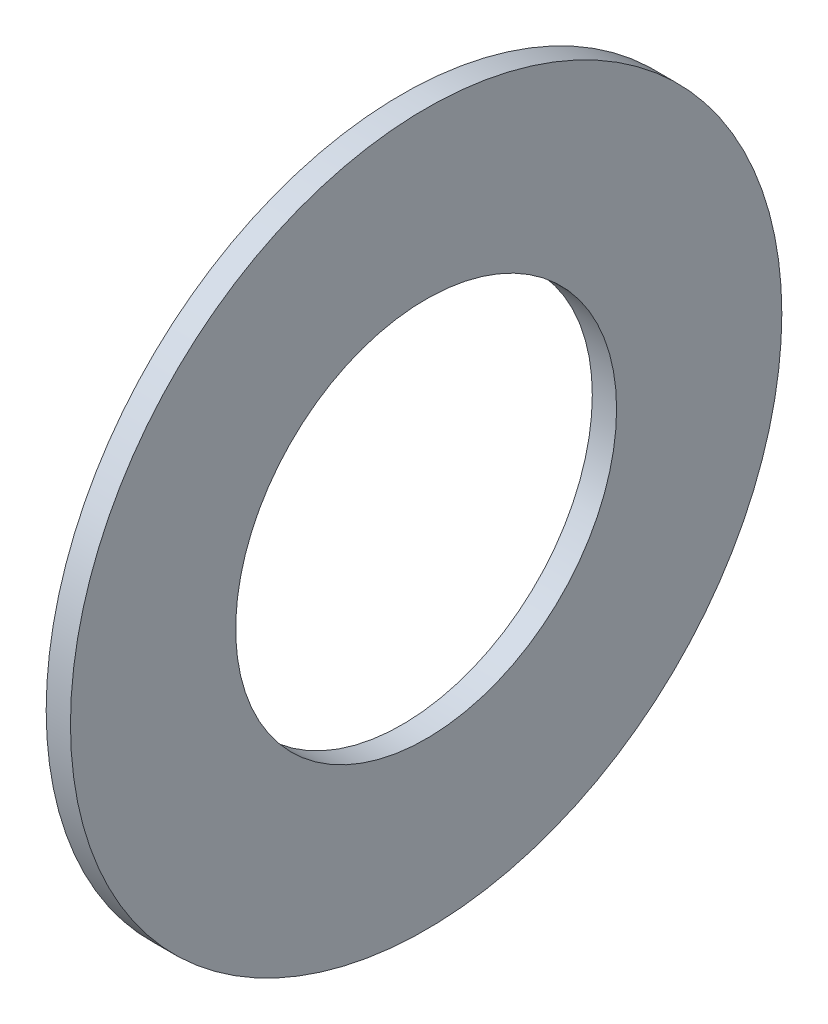
ISO-10303-21;
HEADER;
FILE_DESCRIPTION(('STEP AP214'),'2;1');
FILE_NAME('part.step','',(''),(''),'','','');
FILE_SCHEMA(('AUTOMOTIVE_DESIGN { 1 0 10303 214 1 1 1 1 }'));
ENDSEC;
DATA;
#1=APPLICATION_CONTEXT('core data for automotive mechanical design processes');
#2=APPLICATION_PROTOCOL_DEFINITION('international standard','automotive_design',2000,#1);
#3=PRODUCT_CONTEXT('',#1,'mechanical');
#4=PRODUCT('Part','Part','',(#3));
#5=PRODUCT_RELATED_PRODUCT_CATEGORY('part','',(#4));
#6=PRODUCT_DEFINITION_FORMATION('','',#4);
#7=PRODUCT_DEFINITION_CONTEXT('part definition',#1,'design');
#8=PRODUCT_DEFINITION('design','',#6,#7);
#9=PRODUCT_DEFINITION_SHAPE('','',#8);
#10=(LENGTH_UNIT() NAMED_UNIT(*) SI_UNIT(.MILLI.,.METRE.));
#11=(NAMED_UNIT(*) PLANE_ANGLE_UNIT() SI_UNIT($,.RADIAN.));
#12=(NAMED_UNIT(*) SI_UNIT($,.STERADIAN.) SOLID_ANGLE_UNIT());
#13=UNCERTAINTY_MEASURE_WITH_UNIT(LENGTH_MEASURE(1.E-05),#10,'distance_accuracy_value','');
#14=(GEOMETRIC_REPRESENTATION_CONTEXT(3) GLOBAL_UNCERTAINTY_ASSIGNED_CONTEXT((#13)) GLOBAL_UNIT_ASSIGNED_CONTEXT((#10,
#11,#12)) REPRESENTATION_CONTEXT('',''));
#15=CARTESIAN_POINT('',(0.,0.,0.));
#16=DIRECTION('',(0.,0.,1.));
#17=DIRECTION('',(1.,0.,0.));
#18=AXIS2_PLACEMENT_3D('',#15,#16,#17);
#19=CARTESIAN_POINT('',(0.4064,0.,0.));
#20=DIRECTION('',(1.,0.,0.));
#21=DIRECTION('',(0.,0.,-1.));
#22=AXIS2_PLACEMENT_3D('',#19,#20,#21);
#23=PLANE('',#22);
#24=CARTESIAN_POINT('',(0.4064,0.,0.));
#25=DIRECTION('',(1.,0.,0.));
#26=DIRECTION('',(0.,0.,-1.));
#27=AXIS2_PLACEMENT_3D('',#24,#25,#26);
#28=CIRCLE('',#27,11.90625);
#29=CARTESIAN_POINT('',(0.4064,0.,-11.90625));
#30=VERTEX_POINT('',#29);
#31=EDGE_CURVE('E10',#30,#30,#28,.T.);
#32=ORIENTED_EDGE('',*,*,#31,.T.);
#33=EDGE_LOOP('',(#32));
#34=FACE_BOUND('',#33,.T.);
#35=CARTESIAN_POINT('',(0.4064,0.,0.));
#36=DIRECTION('',(1.,0.,0.));
#37=DIRECTION('',(0.,0.,-1.));
#38=AXIS2_PLACEMENT_3D('',#35,#36,#37);
#39=CIRCLE('',#38,6.3754);
#40=CARTESIAN_POINT('',(0.4064,0.,-6.3754));
#41=VERTEX_POINT('',#40);
#42=EDGE_CURVE('E45',#41,#41,#39,.T.);
#43=ORIENTED_EDGE('',*,*,#42,.F.);
#44=EDGE_LOOP('',(#43));
#45=FACE_BOUND('',#44,.T.);
#46=ADVANCED_FACE('F34',(#34,#45),#23,.T.);
#47=CARTESIAN_POINT('',(-0.4064,0.,0.));
#48=DIRECTION('',(1.,0.,0.));
#49=DIRECTION('',(0.,0.,-1.));
#50=AXIS2_PLACEMENT_3D('',#47,#48,#49);
#51=PLANE('',#50);
#52=CARTESIAN_POINT('',(-0.4064,0.,0.));
#53=DIRECTION('',(1.,0.,0.));
#54=DIRECTION('',(0.,0.,-1.));
#55=AXIS2_PLACEMENT_3D('',#52,#53,#54);
#56=CIRCLE('',#55,11.90625);
#57=CARTESIAN_POINT('',(-0.4064,0.,-11.90625));
#58=VERTEX_POINT('',#57);
#59=EDGE_CURVE('E38',#58,#58,#56,.T.);
#60=ORIENTED_EDGE('',*,*,#59,.F.);
#61=EDGE_LOOP('',(#60));
#62=FACE_BOUND('',#61,.T.);
#63=CARTESIAN_POINT('',(-0.4064,0.,0.));
#64=DIRECTION('',(1.,0.,0.));
#65=DIRECTION('',(0.,0.,-1.));
#66=AXIS2_PLACEMENT_3D('',#63,#64,#65);
#67=CIRCLE('',#66,6.3754);
#68=CARTESIAN_POINT('',(-0.4064,0.,-6.3754));
#69=VERTEX_POINT('',#68);
#70=EDGE_CURVE('E47',#69,#69,#67,.T.);
#71=ORIENTED_EDGE('',*,*,#70,.T.);
#72=EDGE_LOOP('',(#71));
#73=FACE_BOUND('',#72,.T.);
#74=ADVANCED_FACE('F57',(#62,#73),#51,.F.);
#75=CARTESIAN_POINT('',(0.4064,0.,0.));
#76=DIRECTION('',(-1.,0.,0.));
#77=DIRECTION('',(0.,0.,1.));
#78=AXIS2_PLACEMENT_3D('',#75,#76,#77);
#79=CYLINDRICAL_SURFACE('',#78,11.90625);
#80=ORIENTED_EDGE('',*,*,#31,.F.);
#81=EDGE_LOOP('',(#80));
#82=FACE_BOUND('',#81,.T.);
#83=ORIENTED_EDGE('',*,*,#59,.T.);
#84=EDGE_LOOP('',(#83));
#85=FACE_BOUND('',#84,.T.);
#86=ADVANCED_FACE('F36',(#82,#85),#79,.T.);
#87=CARTESIAN_POINT('',(0.4064,0.,0.));
#88=DIRECTION('',(-1.,0.,0.));
#89=DIRECTION('',(0.,0.,1.));
#90=AXIS2_PLACEMENT_3D('',#87,#88,#89);
#91=CYLINDRICAL_SURFACE('',#90,6.3754);
#92=ORIENTED_EDGE('',*,*,#42,.T.);
#93=EDGE_LOOP('',(#92));
#94=FACE_BOUND('',#93,.T.);
#95=ORIENTED_EDGE('',*,*,#70,.F.);
#96=EDGE_LOOP('',(#95));
#97=FACE_BOUND('',#96,.T.);
#98=ADVANCED_FACE('F53',(#94,#97),#91,.F.);
#99=CLOSED_SHELL('',(#46,#74,#86,#98));
#100=MANIFOLD_SOLID_BREP('B2',#99);
#101=ADVANCED_BREP_SHAPE_REPRESENTATION('',(#18,#100),#14);
#102=SHAPE_DEFINITION_REPRESENTATION(#9,#101);
ENDSEC;
END-ISO-10303-21;
